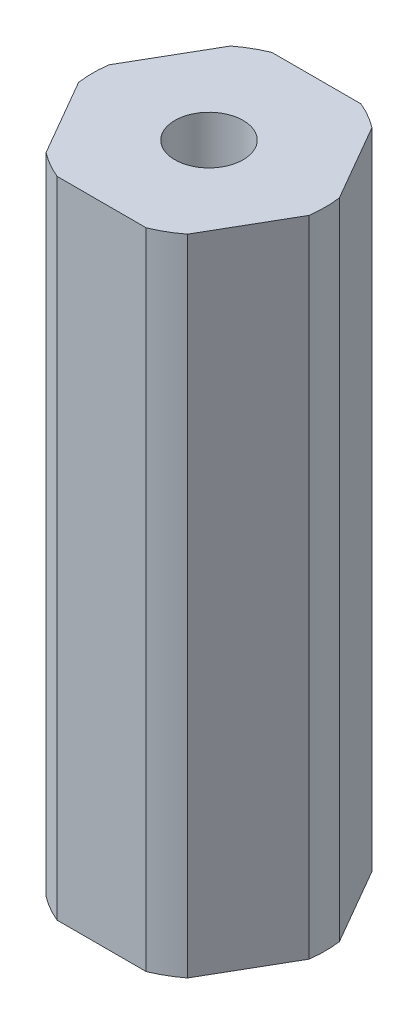
ISO-10303-21;
HEADER;
FILE_DESCRIPTION(('STEP AP214'),'2;1');
FILE_NAME('part.step','',(''),(''),'','','');
FILE_SCHEMA(('AUTOMOTIVE_DESIGN { 1 0 10303 214 1 1 1 1 }'));
ENDSEC;
DATA;
#1=APPLICATION_CONTEXT('core data for automotive mechanical design processes');
#2=APPLICATION_PROTOCOL_DEFINITION('international standard','automotive_design',2000,#1);
#3=PRODUCT_CONTEXT('',#1,'mechanical');
#4=PRODUCT('Part','Part','',(#3));
#5=PRODUCT_RELATED_PRODUCT_CATEGORY('part','',(#4));
#6=PRODUCT_DEFINITION_FORMATION('','',#4);
#7=PRODUCT_DEFINITION_CONTEXT('part definition',#1,'design');
#8=PRODUCT_DEFINITION('design','',#6,#7);
#9=PRODUCT_DEFINITION_SHAPE('','',#8);
#10=(LENGTH_UNIT() NAMED_UNIT(*) SI_UNIT(.MILLI.,.METRE.));
#11=(NAMED_UNIT(*) PLANE_ANGLE_UNIT() SI_UNIT($,.RADIAN.));
#12=(NAMED_UNIT(*) SI_UNIT($,.STERADIAN.) SOLID_ANGLE_UNIT());
#13=UNCERTAINTY_MEASURE_WITH_UNIT(LENGTH_MEASURE(1.E-05),#10,'distance_accuracy_value','');
#14=(GEOMETRIC_REPRESENTATION_CONTEXT(3) GLOBAL_UNCERTAINTY_ASSIGNED_CONTEXT((#13)) GLOBAL_UNIT_ASSIGNED_CONTEXT((#10,
#11,#12)) REPRESENTATION_CONTEXT('',''));
#15=CARTESIAN_POINT('',(0.,0.,0.));
#16=DIRECTION('',(0.,0.,1.));
#17=DIRECTION('',(1.,0.,0.));
#18=AXIS2_PLACEMENT_3D('',#15,#16,#17);
#19=CARTESIAN_POINT('',(5.49926131403119,38.1,3.175));
#20=DIRECTION('',(0.866025403784439,0.,0.5));
#21=DIRECTION('',(0.5,0.,-0.866025403784439));
#22=AXIS2_PLACEMENT_3D('',#19,#20,#21);
#23=PLANE('',#22);
#24=DIRECTION('',(-0.5,0.,0.866025403784439));
#25=VECTOR('',#24,1.);
#26=CARTESIAN_POINT('',(5.49926131403119,38.1,3.175));
#27=LINE('',#26,#25);
#28=CARTESIAN_POINT('',(6.81675182633099,38.1,0.893039494206794));
#29=VERTEX_POINT('',#28);
#30=CARTESIAN_POINT('',(4.18177080173138,38.1,5.45696050579321));
#31=VERTEX_POINT('',#30);
#32=EDGE_CURVE('E142',#29,#31,#27,.T.);
#33=ORIENTED_EDGE('',*,*,#32,.T.);
#34=DIRECTION('',(0.,-1.,0.));
#35=VECTOR('',#34,1.);
#36=CARTESIAN_POINT('',(4.18177080173138,43.3887582425623,5.45696050579321));
#37=LINE('',#36,#35);
#38=CARTESIAN_POINT('',(4.18177080173138,0.,5.45696050579321));
#39=VERTEX_POINT('',#38);
#40=EDGE_CURVE('E189',#31,#39,#37,.T.);
#41=ORIENTED_EDGE('',*,*,#40,.T.);
#42=DIRECTION('',(-0.5,0.,0.866025403784439));
#43=VECTOR('',#42,1.);
#44=CARTESIAN_POINT('',(5.49926131403119,0.,3.175));
#45=LINE('',#44,#43);
#46=CARTESIAN_POINT('',(6.81675182633099,0.,0.893039494206794));
#47=VERTEX_POINT('',#46);
#48=EDGE_CURVE('E131',#47,#39,#45,.T.);
#49=ORIENTED_EDGE('',*,*,#48,.F.);
#50=DIRECTION('',(0.,-1.,0.));
#51=VECTOR('',#50,1.);
#52=CARTESIAN_POINT('',(6.81675182633099,43.3887582425623,0.893039494206798));
#53=LINE('',#52,#51);
#54=EDGE_CURVE('E180',#47,#29,#53,.F.);
#55=ORIENTED_EDGE('',*,*,#54,.T.);
#56=EDGE_LOOP('',(#33,#41,#49,#55));
#57=FACE_BOUND('',#56,.T.);
#58=ADVANCED_FACE('F17',(#57),#23,.T.);
#59=CARTESIAN_POINT('',(0.,38.1,6.35));
#60=DIRECTION('',(0.,0.,1.));
#61=DIRECTION('',(1.,0.,0.));
#62=AXIS2_PLACEMENT_3D('',#59,#60,#61);
#63=PLANE('',#62);
#64=DIRECTION('',(-1.,0.,0.));
#65=VECTOR('',#64,1.);
#66=CARTESIAN_POINT('',(0.,38.1,6.35));
#67=LINE('',#66,#65);
#68=CARTESIAN_POINT('',(2.63498102459961,38.1,6.35));
#69=VERTEX_POINT('',#68);
#70=CARTESIAN_POINT('',(-2.63498102459961,38.1,6.35));
#71=VERTEX_POINT('',#70);
#72=EDGE_CURVE('E170',#69,#71,#67,.T.);
#73=ORIENTED_EDGE('',*,*,#72,.T.);
#74=DIRECTION('',(0.,-1.,0.));
#75=VECTOR('',#74,1.);
#76=CARTESIAN_POINT('',(-2.63498102459961,43.3887582425623,6.35));
#77=LINE('',#76,#75);
#78=CARTESIAN_POINT('',(-2.63498102459961,0.,6.35));
#79=VERTEX_POINT('',#78);
#80=EDGE_CURVE('E35',#71,#79,#77,.T.);
#81=ORIENTED_EDGE('',*,*,#80,.T.);
#82=DIRECTION('',(-1.,0.,0.));
#83=VECTOR('',#82,1.);
#84=CARTESIAN_POINT('',(0.,0.,6.35));
#85=LINE('',#84,#83);
#86=CARTESIAN_POINT('',(2.63498102459961,0.,6.35));
#87=VERTEX_POINT('',#86);
#88=EDGE_CURVE('E149',#87,#79,#85,.T.);
#89=ORIENTED_EDGE('',*,*,#88,.F.);
#90=DIRECTION('',(0.,-1.,0.));
#91=VECTOR('',#90,1.);
#92=CARTESIAN_POINT('',(2.63498102459961,43.3887582425623,6.35));
#93=LINE('',#92,#91);
#94=EDGE_CURVE('E193',#87,#69,#93,.F.);
#95=ORIENTED_EDGE('',*,*,#94,.T.);
#96=EDGE_LOOP('',(#73,#81,#89,#95));
#97=FACE_BOUND('',#96,.T.);
#98=ADVANCED_FACE('F250',(#97),#63,.T.);
#99=CARTESIAN_POINT('',(-5.49926131403119,38.1,3.175));
#100=DIRECTION('',(-0.866025403784439,0.,0.5));
#101=DIRECTION('',(0.5,0.,0.866025403784439));
#102=AXIS2_PLACEMENT_3D('',#99,#100,#101);
#103=PLANE('',#102);
#104=DIRECTION('',(-0.5,0.,-0.866025403784439));
#105=VECTOR('',#104,1.);
#106=CARTESIAN_POINT('',(-5.49926131403119,38.1,3.175));
#107=LINE('',#106,#105);
#108=CARTESIAN_POINT('',(-4.18177080173138,38.1,5.45696050579321));
#109=VERTEX_POINT('',#108);
#110=CARTESIAN_POINT('',(-6.81675182633099,38.1,0.893039494206794));
#111=VERTEX_POINT('',#110);
#112=EDGE_CURVE('E166',#109,#111,#107,.T.);
#113=ORIENTED_EDGE('',*,*,#112,.T.);
#114=DIRECTION('',(0.,-1.,0.));
#115=VECTOR('',#114,1.);
#116=CARTESIAN_POINT('',(-6.81675182633099,43.3887582425623,0.893039494206798));
#117=LINE('',#116,#115);
#118=CARTESIAN_POINT('',(-6.81675182633099,0.,0.893039494206794));
#119=VERTEX_POINT('',#118);
#120=EDGE_CURVE('E43',#111,#119,#117,.T.);
#121=ORIENTED_EDGE('',*,*,#120,.T.);
#122=DIRECTION('',(-0.5,0.,-0.866025403784439));
#123=VECTOR('',#122,1.);
#124=CARTESIAN_POINT('',(-5.49926131403119,0.,3.175));
#125=LINE('',#124,#123);
#126=CARTESIAN_POINT('',(-4.18177080173138,0.,5.45696050579321));
#127=VERTEX_POINT('',#126);
#128=EDGE_CURVE('E144',#127,#119,#125,.T.);
#129=ORIENTED_EDGE('',*,*,#128,.F.);
#130=DIRECTION('',(0.,-1.,0.));
#131=VECTOR('',#130,1.);
#132=CARTESIAN_POINT('',(-4.18177080173138,43.3887582425623,5.45696050579321));
#133=LINE('',#132,#131);
#134=EDGE_CURVE('E200',#127,#109,#133,.F.);
#135=ORIENTED_EDGE('',*,*,#134,.T.);
#136=EDGE_LOOP('',(#113,#121,#129,#135));
#137=FACE_BOUND('',#136,.T.);
#138=ADVANCED_FACE('F255',(#137),#103,.T.);
#139=CARTESIAN_POINT('',(-5.49926131403119,38.1,-3.175));
#140=DIRECTION('',(-0.866025403784439,0.,-0.5));
#141=DIRECTION('',(-0.5,0.,0.866025403784439));
#142=AXIS2_PLACEMENT_3D('',#139,#140,#141);
#143=PLANE('',#142);
#144=DIRECTION('',(0.5,0.,-0.866025403784439));
#145=VECTOR('',#144,1.);
#146=CARTESIAN_POINT('',(-5.49926131403119,38.1,-3.175));
#147=LINE('',#146,#145);
#148=CARTESIAN_POINT('',(-6.81675182633099,38.1,-0.893039494206793));
#149=VERTEX_POINT('',#148);
#150=CARTESIAN_POINT('',(-4.18177080173138,38.1,-5.45696050579321));
#151=VERTEX_POINT('',#150);
#152=EDGE_CURVE('E162',#149,#151,#147,.T.);
#153=ORIENTED_EDGE('',*,*,#152,.T.);
#154=DIRECTION('',(0.,-1.,0.));
#155=VECTOR('',#154,1.);
#156=CARTESIAN_POINT('',(-4.18177080173139,43.3887582425623,-5.4569605057932));
#157=LINE('',#156,#155);
#158=CARTESIAN_POINT('',(-4.18177080173138,0.,-5.45696050579321));
#159=VERTEX_POINT('',#158);
#160=EDGE_CURVE('E211',#151,#159,#157,.T.);
#161=ORIENTED_EDGE('',*,*,#160,.T.);
#162=DIRECTION('',(0.5,0.,-0.866025403784439));
#163=VECTOR('',#162,1.);
#164=CARTESIAN_POINT('',(-5.49926131403119,0.,-3.175));
#165=LINE('',#164,#163);
#166=CARTESIAN_POINT('',(-6.81675182633099,0.,-0.893039494206793));
#167=VERTEX_POINT('',#166);
#168=EDGE_CURVE('E137',#167,#159,#165,.T.);
#169=ORIENTED_EDGE('',*,*,#168,.F.);
#170=DIRECTION('',(0.,-1.,0.));
#171=VECTOR('',#170,1.);
#172=CARTESIAN_POINT('',(-6.81675182633099,43.3887582425623,-0.893039494206801));
#173=LINE('',#172,#171);
#174=EDGE_CURVE('E206',#167,#149,#173,.F.);
#175=ORIENTED_EDGE('',*,*,#174,.T.);
#176=EDGE_LOOP('',(#153,#161,#169,#175));
#177=FACE_BOUND('',#176,.T.);
#178=ADVANCED_FACE('F308',(#177),#143,.T.);
#179=CARTESIAN_POINT('',(0.,38.1,-6.35));
#180=DIRECTION('',(0.,0.,-1.));
#181=DIRECTION('',(-1.,0.,0.));
#182=AXIS2_PLACEMENT_3D('',#179,#180,#181);
#183=PLANE('',#182);
#184=DIRECTION('',(1.,0.,0.));
#185=VECTOR('',#184,1.);
#186=CARTESIAN_POINT('',(0.,38.1,-6.35));
#187=LINE('',#186,#185);
#188=CARTESIAN_POINT('',(-2.63498102459961,38.1,-6.35));
#189=VERTEX_POINT('',#188);
#190=CARTESIAN_POINT('',(2.63498102459961,38.1,-6.35));
#191=VERTEX_POINT('',#190);
#192=EDGE_CURVE('E129',#189,#191,#187,.T.);
#193=ORIENTED_EDGE('',*,*,#192,.T.);
#194=DIRECTION('',(0.,-1.,0.));
#195=VECTOR('',#194,1.);
#196=CARTESIAN_POINT('',(2.63498102459961,43.3887582425623,-6.35));
#197=LINE('',#196,#195);
#198=CARTESIAN_POINT('',(2.63498102459961,0.,-6.35));
#199=VERTEX_POINT('',#198);
#200=EDGE_CURVE('E110',#191,#199,#197,.T.);
#201=ORIENTED_EDGE('',*,*,#200,.T.);
#202=DIRECTION('',(1.,0.,0.));
#203=VECTOR('',#202,1.);
#204=CARTESIAN_POINT('',(0.,0.,-6.35));
#205=LINE('',#204,#203);
#206=CARTESIAN_POINT('',(-2.63498102459961,0.,-6.35));
#207=VERTEX_POINT('',#206);
#208=EDGE_CURVE('E127',#207,#199,#205,.T.);
#209=ORIENTED_EDGE('',*,*,#208,.F.);
#210=DIRECTION('',(0.,-1.,0.));
#211=VECTOR('',#210,1.);
#212=CARTESIAN_POINT('',(-2.63498102459961,43.3887582425623,-6.35));
#213=LINE('',#212,#211);
#214=EDGE_CURVE('E215',#207,#189,#213,.F.);
#215=ORIENTED_EDGE('',*,*,#214,.T.);
#216=EDGE_LOOP('',(#193,#201,#209,#215));
#217=FACE_BOUND('',#216,.T.);
#218=ADVANCED_FACE('F125',(#217),#183,.T.);
#219=CARTESIAN_POINT('',(5.49926131403119,38.1,-3.175));
#220=DIRECTION('',(0.866025403784439,0.,-0.5));
#221=DIRECTION('',(-0.5,0.,-0.866025403784439));
#222=AXIS2_PLACEMENT_3D('',#219,#220,#221);
#223=PLANE('',#222);
#224=DIRECTION('',(0.5,0.,0.866025403784439));
#225=VECTOR('',#224,1.);
#226=CARTESIAN_POINT('',(5.49926131403119,38.1,-3.175));
#227=LINE('',#226,#225);
#228=CARTESIAN_POINT('',(4.18177080173138,38.1,-5.45696050579321));
#229=VERTEX_POINT('',#228);
#230=CARTESIAN_POINT('',(6.81675182633099,38.1,-0.893039494206797));
#231=VERTEX_POINT('',#230);
#232=EDGE_CURVE('E156',#229,#231,#227,.T.);
#233=ORIENTED_EDGE('',*,*,#232,.T.);
#234=DIRECTION('',(0.,-1.,0.));
#235=VECTOR('',#234,1.);
#236=CARTESIAN_POINT('',(6.81675182633099,43.3887582425623,-0.8930394942068));
#237=LINE('',#236,#235);
#238=CARTESIAN_POINT('',(6.81675182633099,0.,-0.893039494206797));
#239=VERTEX_POINT('',#238);
#240=EDGE_CURVE('E184',#231,#239,#237,.T.);
#241=ORIENTED_EDGE('',*,*,#240,.T.);
#242=DIRECTION('',(0.5,0.,0.866025403784439));
#243=VECTOR('',#242,1.);
#244=CARTESIAN_POINT('',(5.49926131403119,0.,-3.175));
#245=LINE('',#244,#243);
#246=CARTESIAN_POINT('',(4.18177080173138,0.,-5.45696050579321));
#247=VERTEX_POINT('',#246);
#248=EDGE_CURVE('E20',#247,#239,#245,.T.);
#249=ORIENTED_EDGE('',*,*,#248,.F.);
#250=DIRECTION('',(0.,-1.,0.));
#251=VECTOR('',#250,1.);
#252=CARTESIAN_POINT('',(4.18177080173138,43.3887582425623,-5.45696050579321));
#253=LINE('',#252,#251);
#254=EDGE_CURVE('E113',#247,#229,#253,.F.);
#255=ORIENTED_EDGE('',*,*,#254,.T.);
#256=EDGE_LOOP('',(#233,#241,#249,#255));
#257=FACE_BOUND('',#256,.T.);
#258=ADVANCED_FACE('F245',(#257),#223,.T.);
#259=CARTESIAN_POINT('',(0.,38.1,0.));
#260=DIRECTION('',(0.,-1.,0.));
#261=DIRECTION('',(1.,0.,0.));
#262=AXIS2_PLACEMENT_3D('',#259,#260,#261);
#263=PLANE('',#262);
#264=CARTESIAN_POINT('',(0.,38.1,0.));
#265=DIRECTION('',(0.,-1.,0.));
#266=DIRECTION('',(0.,0.,-1.));
#267=AXIS2_PLACEMENT_3D('',#264,#265,#266);
#268=CIRCLE('',#267,2.0193);
#269=CARTESIAN_POINT('',(0.,38.1,-2.0193));
#270=VERTEX_POINT('',#269);
#271=EDGE_CURVE('E120',#270,#270,#268,.T.);
#272=ORIENTED_EDGE('',*,*,#271,.T.);
#273=EDGE_LOOP('',(#272));
#274=FACE_BOUND('',#273,.T.);
#275=CARTESIAN_POINT('',(0.,38.1,0.));
#276=DIRECTION('',(0.,-1.,0.));
#277=DIRECTION('',(0.,0.,-1.));
#278=AXIS2_PLACEMENT_3D('',#275,#276,#277);
#279=CIRCLE('',#278,6.875);
#280=EDGE_CURVE('E179',#191,#229,#279,.T.);
#281=ORIENTED_EDGE('',*,*,#280,.F.);
#282=ORIENTED_EDGE('',*,*,#192,.F.);
#283=EDGE_CURVE('E119',#151,#189,#279,.T.);
#284=ORIENTED_EDGE('',*,*,#283,.F.);
#285=ORIENTED_EDGE('',*,*,#152,.F.);
#286=EDGE_CURVE('E210',#111,#149,#279,.T.);
#287=ORIENTED_EDGE('',*,*,#286,.F.);
#288=ORIENTED_EDGE('',*,*,#112,.F.);
#289=EDGE_CURVE('E204',#71,#109,#279,.T.);
#290=ORIENTED_EDGE('',*,*,#289,.F.);
#291=ORIENTED_EDGE('',*,*,#72,.F.);
#292=EDGE_CURVE('E197',#31,#69,#279,.T.);
#293=ORIENTED_EDGE('',*,*,#292,.F.);
#294=ORIENTED_EDGE('',*,*,#32,.F.);
#295=EDGE_CURVE('E188',#231,#29,#279,.T.);
#296=ORIENTED_EDGE('',*,*,#295,.F.);
#297=ORIENTED_EDGE('',*,*,#232,.F.);
#298=EDGE_LOOP('',(#281,#282,#284,#285,#287,#288,#290,#291,#293,#294,#296,#297));
#299=FACE_BOUND('',#298,.T.);
#300=ADVANCED_FACE('F234',(#274,#299),#263,.F.);
#301=CARTESIAN_POINT('',(0.,0.,0.));
#302=DIRECTION('',(0.,-1.,0.));
#303=DIRECTION('',(1.,0.,0.));
#304=AXIS2_PLACEMENT_3D('',#301,#302,#303);
#305=PLANE('',#304);
#306=CARTESIAN_POINT('',(0.,0.,0.));
#307=DIRECTION('',(0.,-1.,0.));
#308=DIRECTION('',(0.,0.,-1.));
#309=AXIS2_PLACEMENT_3D('',#306,#307,#308);
#310=CIRCLE('',#309,2.0193);
#311=CARTESIAN_POINT('',(0.,0.,-2.0193));
#312=VERTEX_POINT('',#311);
#313=EDGE_CURVE('E223',#312,#312,#310,.T.);
#314=ORIENTED_EDGE('',*,*,#313,.F.);
#315=EDGE_LOOP('',(#314));
#316=FACE_BOUND('',#315,.T.);
#317=ORIENTED_EDGE('',*,*,#208,.T.);
#318=CARTESIAN_POINT('',(0.,0.,0.));
#319=DIRECTION('',(0.,-1.,0.));
#320=DIRECTION('',(0.,0.,-1.));
#321=AXIS2_PLACEMENT_3D('',#318,#319,#320);
#322=CIRCLE('',#321,6.875);
#323=EDGE_CURVE('E28',#199,#247,#322,.T.);
#324=ORIENTED_EDGE('',*,*,#323,.T.);
#325=ORIENTED_EDGE('',*,*,#248,.T.);
#326=EDGE_CURVE('E11',#239,#47,#322,.T.);
#327=ORIENTED_EDGE('',*,*,#326,.T.);
#328=ORIENTED_EDGE('',*,*,#48,.T.);
#329=EDGE_CURVE('E26',#39,#87,#322,.T.);
#330=ORIENTED_EDGE('',*,*,#329,.T.);
#331=ORIENTED_EDGE('',*,*,#88,.T.);
#332=EDGE_CURVE('E403',#79,#127,#322,.T.);
#333=ORIENTED_EDGE('',*,*,#332,.T.);
#334=ORIENTED_EDGE('',*,*,#128,.T.);
#335=EDGE_CURVE('E406',#119,#167,#322,.T.);
#336=ORIENTED_EDGE('',*,*,#335,.T.);
#337=ORIENTED_EDGE('',*,*,#168,.T.);
#338=EDGE_CURVE('E121',#159,#207,#322,.T.);
#339=ORIENTED_EDGE('',*,*,#338,.T.);
#340=EDGE_LOOP('',(#317,#324,#325,#327,#328,#330,#331,#333,#334,#336,#337,#339));
#341=FACE_BOUND('',#340,.T.);
#342=ADVANCED_FACE('F134',(#316,#341),#305,.T.);
#343=CARTESIAN_POINT('',(0.,43.3887582425623,0.));
#344=DIRECTION('',(0.,-1.,0.));
#345=DIRECTION('',(0.,0.,-1.));
#346=AXIS2_PLACEMENT_3D('',#343,#344,#345);
#347=CYLINDRICAL_SURFACE('',#346,6.875);
#348=ORIENTED_EDGE('',*,*,#283,.T.);
#349=ORIENTED_EDGE('',*,*,#214,.F.);
#350=ORIENTED_EDGE('',*,*,#338,.F.);
#351=ORIENTED_EDGE('',*,*,#160,.F.);
#352=EDGE_LOOP('',(#348,#349,#350,#351));
#353=FACE_BOUND('',#352,.T.);
#354=ADVANCED_FACE('F233',(#353),#347,.T.);
#355=ORIENTED_EDGE('',*,*,#286,.T.);
#356=ORIENTED_EDGE('',*,*,#174,.F.);
#357=ORIENTED_EDGE('',*,*,#335,.F.);
#358=ORIENTED_EDGE('',*,*,#120,.F.);
#359=EDGE_LOOP('',(#355,#356,#357,#358));
#360=FACE_BOUND('',#359,.T.);
#361=ADVANCED_FACE('F242',(#360),#347,.T.);
#362=ORIENTED_EDGE('',*,*,#289,.T.);
#363=ORIENTED_EDGE('',*,*,#134,.F.);
#364=ORIENTED_EDGE('',*,*,#332,.F.);
#365=ORIENTED_EDGE('',*,*,#80,.F.);
#366=EDGE_LOOP('',(#362,#363,#364,#365));
#367=FACE_BOUND('',#366,.T.);
#368=ADVANCED_FACE('F277',(#367),#347,.T.);
#369=ORIENTED_EDGE('',*,*,#292,.T.);
#370=ORIENTED_EDGE('',*,*,#94,.F.);
#371=ORIENTED_EDGE('',*,*,#329,.F.);
#372=ORIENTED_EDGE('',*,*,#40,.F.);
#373=EDGE_LOOP('',(#369,#370,#371,#372));
#374=FACE_BOUND('',#373,.T.);
#375=ADVANCED_FACE('F273',(#374),#347,.T.);
#376=ORIENTED_EDGE('',*,*,#326,.F.);
#377=ORIENTED_EDGE('',*,*,#240,.F.);
#378=ORIENTED_EDGE('',*,*,#295,.T.);
#379=ORIENTED_EDGE('',*,*,#54,.F.);
#380=EDGE_LOOP('',(#376,#377,#378,#379));
#381=FACE_BOUND('',#380,.T.);
#382=ADVANCED_FACE('F271',(#381),#347,.T.);
#383=ORIENTED_EDGE('',*,*,#280,.T.);
#384=ORIENTED_EDGE('',*,*,#254,.F.);
#385=ORIENTED_EDGE('',*,*,#323,.F.);
#386=ORIENTED_EDGE('',*,*,#200,.F.);
#387=EDGE_LOOP('',(#383,#384,#385,#386));
#388=FACE_BOUND('',#387,.T.);
#389=ADVANCED_FACE('F109',(#388),#347,.T.);
#390=CARTESIAN_POINT('',(0.,42.4595288548648,0.));
#391=DIRECTION('',(0.,-1.,0.));
#392=DIRECTION('',(0.,0.,-1.));
#393=AXIS2_PLACEMENT_3D('',#390,#391,#392);
#394=CYLINDRICAL_SURFACE('',#393,2.0193);
#395=ORIENTED_EDGE('',*,*,#313,.T.);
#396=EDGE_LOOP('',(#395));
#397=FACE_BOUND('',#396,.T.);
#398=ORIENTED_EDGE('',*,*,#271,.F.);
#399=EDGE_LOOP('',(#398));
#400=FACE_BOUND('',#399,.T.);
#401=ADVANCED_FACE('F229',(#397,#400),#394,.F.);
#402=CLOSED_SHELL('',(#58,#98,#138,#178,#218,#258,#300,#342,#354,#361,#368,#375,#382,#389,#401));
#403=MANIFOLD_SOLID_BREP('B1',#402);
#404=ADVANCED_BREP_SHAPE_REPRESENTATION('',(#18,#403),#14);
#405=SHAPE_DEFINITION_REPRESENTATION(#9,#404);
ENDSEC;
END-ISO-10303-21;
